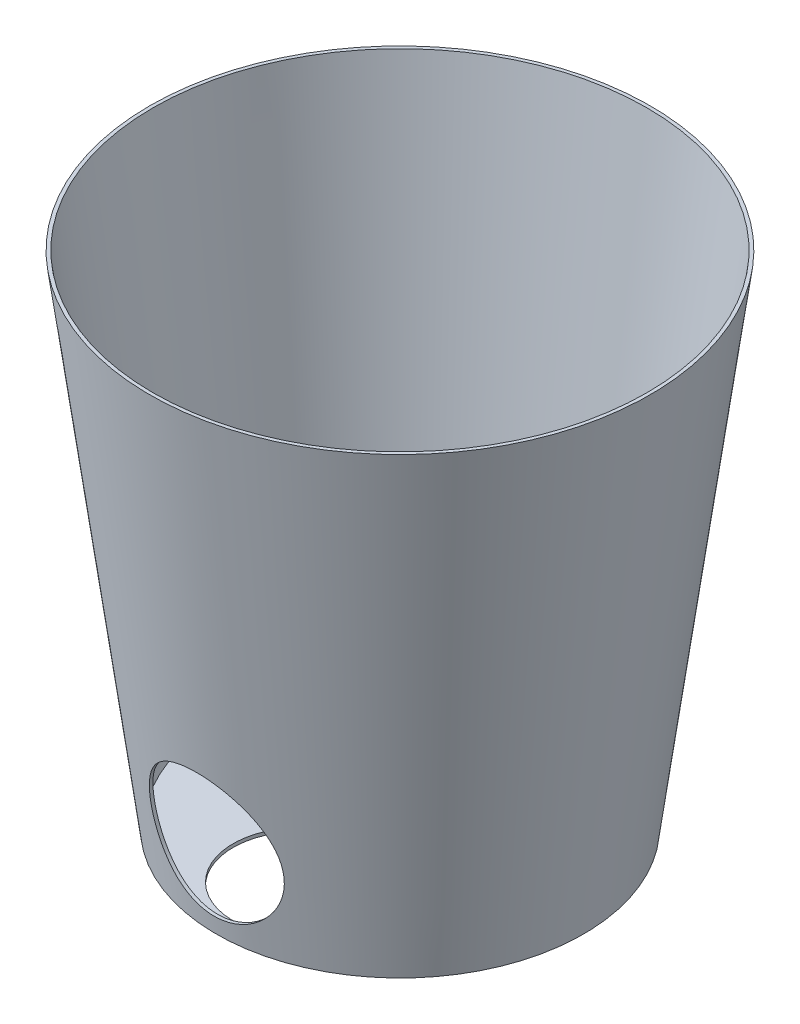
ISO-10303-21;
HEADER;
FILE_DESCRIPTION(('STEP AP214'),'2;1');
FILE_NAME('part.step','',(''),(''),'','','');
FILE_SCHEMA(('AUTOMOTIVE_DESIGN { 1 0 10303 214 1 1 1 1 }'));
ENDSEC;
DATA;
#1=APPLICATION_CONTEXT('core data for automotive mechanical design processes');
#2=APPLICATION_PROTOCOL_DEFINITION('international standard','automotive_design',2000,#1);
#3=PRODUCT_CONTEXT('',#1,'mechanical');
#4=PRODUCT('Part','Part','',(#3));
#5=PRODUCT_RELATED_PRODUCT_CATEGORY('part','',(#4));
#6=PRODUCT_DEFINITION_FORMATION('','',#4);
#7=PRODUCT_DEFINITION_CONTEXT('part definition',#1,'design');
#8=PRODUCT_DEFINITION('design','',#6,#7);
#9=PRODUCT_DEFINITION_SHAPE('','',#8);
#10=(LENGTH_UNIT() NAMED_UNIT(*) SI_UNIT(.MILLI.,.METRE.));
#11=(NAMED_UNIT(*) PLANE_ANGLE_UNIT() SI_UNIT($,.RADIAN.));
#12=(NAMED_UNIT(*) SI_UNIT($,.STERADIAN.) SOLID_ANGLE_UNIT());
#13=UNCERTAINTY_MEASURE_WITH_UNIT(LENGTH_MEASURE(1.E-05),#10,'distance_accuracy_value','');
#14=(GEOMETRIC_REPRESENTATION_CONTEXT(3) GLOBAL_UNCERTAINTY_ASSIGNED_CONTEXT((#13)) GLOBAL_UNIT_ASSIGNED_CONTEXT((#10,
#11,#12)) REPRESENTATION_CONTEXT('',''));
#15=CARTESIAN_POINT('',(0.,0.,0.));
#16=DIRECTION('',(0.,0.,1.));
#17=DIRECTION('',(1.,0.,0.));
#18=AXIS2_PLACEMENT_3D('',#15,#16,#17);
#19=CARTESIAN_POINT('',(0.,300.,0.));
#20=DIRECTION('',(0.,1.,0.));
#21=DIRECTION('',(-1.,0.,0.));
#22=AXIS2_PLACEMENT_3D('',#19,#20,#21);
#23=CONICAL_SURFACE('',#22,150.,0.132551532296674);
#24=CARTESIAN_POINT('',(0.,300.,0.));
#25=DIRECTION('',(0.,1.,0.));
#26=DIRECTION('',(-1.,0.,0.));
#27=AXIS2_PLACEMENT_3D('',#24,#25,#26);
#28=CIRCLE('',#27,150.);
#29=CARTESIAN_POINT('',(-150.,300.,0.));
#30=VERTEX_POINT('',#29);
#31=EDGE_CURVE('E39',#30,#30,#28,.T.);
#32=ORIENTED_EDGE('',*,*,#31,.F.);
#33=EDGE_LOOP('',(#32));
#34=FACE_BOUND('',#33,.T.);
#35=CARTESIAN_POINT('',(0.,0.,0.));
#36=DIRECTION('',(0.,1.,0.));
#37=DIRECTION('',(-1.,0.,0.));
#38=AXIS2_PLACEMENT_3D('',#35,#36,#37);
#39=CIRCLE('',#38,110.);
#40=CARTESIAN_POINT('',(-110.,0.,0.));
#41=VERTEX_POINT('',#40);
#42=EDGE_CURVE('E10',#41,#41,#39,.T.);
#43=ORIENTED_EDGE('',*,*,#42,.T.);
#44=EDGE_LOOP('',(#43));
#45=FACE_BOUND('',#44,.T.);
#46=CARTESIAN_POINT('',(-28.8552117618387,22.2984340843437,109.225929263817));
#47=CARTESIAN_POINT('',(-29.6078526772952,23.0824165417895,109.135215601533));
#48=CARTESIAN_POINT('',(-30.3287880892968,23.8973596000106,109.049399933345));
#49=CARTESIAN_POINT('',(-31.7024768841229,25.5841075054749,108.892248887753));
#50=CARTESIAN_POINT('',(-32.355233917478,26.4559093042196,108.820912734867));
#51=CARTESIAN_POINT('',(-33.587824200434,28.2504588450548,108.69726684741));
#52=CARTESIAN_POINT('',(-34.1676839250266,29.1731879150501,108.644950192165));
#53=CARTESIAN_POINT('',(-35.2505760178368,31.0636986944687,108.563495523031));
#54=CARTESIAN_POINT('',(-35.7536078515846,32.0314807172515,108.534357670384));
#55=CARTESIAN_POINT('',(-36.6799680149464,34.0071133769449,108.502901502679));
#56=CARTESIAN_POINT('',(-37.1031466734675,35.0150350512853,108.500633067886));
#57=CARTESIAN_POINT('',(-37.8654986399689,37.0618164896239,108.526018955818));
#58=CARTESIAN_POINT('',(-38.2046721933386,38.1006761632385,108.553673191133));
#59=CARTESIAN_POINT('',(-38.7965979501725,40.2012963618402,108.640984223162));
#60=CARTESIAN_POINT('',(-39.0493600382957,41.2630542527053,108.700637357497));
#61=CARTESIAN_POINT('',(-39.4670066559061,43.401360947773,108.853014464421));
#62=CARTESIAN_POINT('',(-39.6318927753045,44.4779094840119,108.945737838631));
#63=CARTESIAN_POINT('',(-39.8700684361833,46.6092365070189,109.161385572907));
#64=CARTESIAN_POINT('',(-39.9456421726306,47.6638474055755,109.283456053807));
#65=CARTESIAN_POINT('',(-40.0132461544071,49.7717467169899,109.557980834782));
#66=CARTESIAN_POINT('',(-40.0052780097165,50.8250351549423,109.710434549271));
#67=CARTESIAN_POINT('',(-39.9068616452054,52.9232892425858,110.043912917298));
#68=CARTESIAN_POINT('',(-39.8164044570128,53.9682539748456,110.224940675694));
#69=CARTESIAN_POINT('',(-39.5547054778474,56.0430849826622,110.612965765263));
#70=CARTESIAN_POINT('',(-39.3834614778704,57.0729508445671,110.819963806444));
#71=CARTESIAN_POINT('',(-38.9574710469534,59.1350363756711,111.261800321853));
#72=CARTESIAN_POINT('',(-38.7008983475668,60.1667675829523,111.497168727587));
#73=CARTESIAN_POINT('',(-38.25641737981,61.6930558162193,111.86511727582));
#74=CARTESIAN_POINT('',(-38.0983101992325,62.1982931110359,111.990256413299));
#75=CARTESIAN_POINT('',(-37.7625237917422,63.2011924388857,112.245021345092));
#76=CARTESIAN_POINT('',(-37.5848406963009,63.6988529524244,112.374648022736));
#77=CARTESIAN_POINT('',(-37.022945748875,65.1794524693632,112.769459496632));
#78=CARTESIAN_POINT('',(-36.6098789009291,66.1500414386228,113.040583491896));
#79=CARTESIAN_POINT('',(-35.7099524243151,68.0529116090237,113.594072679293));
#80=CARTESIAN_POINT('',(-35.2230870586121,68.9851898247507,113.876438744116));
#81=CARTESIAN_POINT('',(-34.1398631194353,70.8744020805869,114.46896825068));
#82=CARTESIAN_POINT('',(-33.5380770008128,71.8280822336684,114.779645753911));
#83=CARTESIAN_POINT('',(-32.5771434030956,73.2173862130763,115.24697671351));
#84=CARTESIAN_POINT('',(-32.2471059842941,73.673638965409,115.402980297728));
#85=CARTESIAN_POINT('',(-31.5679158904362,74.57201351374,115.714780718406));
#86=CARTESIAN_POINT('',(-31.2187571851858,75.0141307814609,115.870577473589));
#87=CARTESIAN_POINT('',(-30.1433540708662,76.3182039654291,116.336531383407));
#88=CARTESIAN_POINT('',(-29.3891785055201,77.1578872731768,116.645254217388));
#89=CARTESIAN_POINT('',(-27.810615774689,78.772279312574,117.252884690914));
#90=CARTESIAN_POINT('',(-26.9862313167518,79.546990547533,117.551792708343));
#91=CARTESIAN_POINT('',(-25.6863750890817,80.6684221448194,117.993165092794));
#92=CARTESIAN_POINT('',(-25.2349188019589,81.0409725717029,118.141394583244));
#93=CARTESIAN_POINT('',(-24.3152154931545,81.7665444253133,118.432867356452));
#94=CARTESIAN_POINT('',(-23.8469724356255,82.1195704132665,118.576111800873));
#95=CARTESIAN_POINT('',(-22.4177825290221,83.1484645506448,118.997276055708));
#96=CARTESIAN_POINT('',(-21.4323007943207,83.7942129055679,119.266652154694));
#97=CARTESIAN_POINT('',(-19.4030256057108,84.9987817792813,119.776244568045));
#98=CARTESIAN_POINT('',(-18.3592525027189,85.5576323814759,120.016470967481));
#99=CARTESIAN_POINT('',(-16.2201260924834,86.5829704442204,120.462176599163));
#100=CARTESIAN_POINT('',(-15.1247769302509,87.0494653114906,120.667658617637));
#101=CARTESIAN_POINT('',(-12.9566764034448,87.860059376338,121.027762947024));
#102=CARTESIAN_POINT('',(-11.8863925593456,88.2097483813546,121.184667667346));
#103=CARTESIAN_POINT('',(-9.71543836076685,88.8185639519475,121.459434021423));
#104=CARTESIAN_POINT('',(-8.61476905085876,89.0776936265397,121.577296995523));
#105=CARTESIAN_POINT('',(-6.39241646820968,89.5021026516217,121.771038356065));
#106=CARTESIAN_POINT('',(-5.27074437141425,89.6674305275196,121.846938450161));
#107=CARTESIAN_POINT('',(-3.01534234143438,89.9022921502697,121.954922386239));
#108=CARTESIAN_POINT('',(-1.88161320886809,89.9718322181468,121.987009119458));
#109=CARTESIAN_POINT('',(0.295407459960031,90.012494140787,122.005762484004));
#110=CARTESIAN_POINT('',(1.33853651501947,89.9911776064504,121.995918846567));
#111=CARTESIAN_POINT('',(3.41887227487275,89.8672412460667,121.938816696897));
#112=CARTESIAN_POINT('',(4.45607935320611,89.7646266064076,121.891560571382));
#113=CARTESIAN_POINT('',(6.51698310351077,89.4792494999368,121.760657976467));
#114=CARTESIAN_POINT('',(7.54068064179793,89.2964921983509,121.677013852291));
#115=CARTESIAN_POINT('',(9.56749553949532,88.8527899976588,121.475101419155));
#116=CARTESIAN_POINT('',(10.5706125495393,88.5918437724224,121.356832522938));
#117=CARTESIAN_POINT('',(12.5390468470389,87.9976056483088,121.089527283522));
#118=CARTESIAN_POINT('',(13.5046534011471,87.6651160870942,120.94083299324));
#119=CARTESIAN_POINT('',(15.4034167132039,86.9292770149475,120.614788214765));
#120=CARTESIAN_POINT('',(16.3365740064413,86.5259286735796,120.437438199553));
#121=CARTESIAN_POINT('',(18.1654731940975,85.6516907043168,120.057302538831));
#122=CARTESIAN_POINT('',(19.061208734602,85.1807896662115,119.854512597034));
#123=CARTESIAN_POINT('',(20.8105709254929,84.1751126547883,119.427077578062));
#124=CARTESIAN_POINT('',(21.66419563411,83.6403337398856,119.202431494498));
#125=CARTESIAN_POINT('',(23.3812309060486,82.4725549553692,118.719306224354));
#126=CARTESIAN_POINT('',(24.2414534550967,81.835371931385,118.459568240461));
#127=CARTESIAN_POINT('',(25.4890215228946,80.8317186998092,118.058115003916));
#128=CARTESIAN_POINT('',(25.897774613224,80.4891644764301,117.922313846893));
#129=CARTESIAN_POINT('',(26.7007161508975,79.7885160474194,117.647311109864));
#130=CARTESIAN_POINT('',(27.0949016238796,79.4304187003518,117.508108844965));
#131=CARTESIAN_POINT('',(28.2549478873026,78.3335604139713,117.086279908928));
#132=CARTESIAN_POINT('',(28.9982187412577,77.572297472093,116.7994569403));
#133=CARTESIAN_POINT('',(30.4207631996352,75.9943393937437,116.21958840554));
#134=CARTESIAN_POINT('',(31.100033868939,75.1776417179271,115.926542554774));
#135=CARTESIAN_POINT('',(32.0939191172065,73.8811274686743,115.474419301902));
#136=CARTESIAN_POINT('',(32.432442316121,73.419317242662,115.315776762261));
#137=CARTESIAN_POINT('',(33.0893400648887,72.4816199331279,114.998909527437));
#138=CARTESIAN_POINT('',(33.4077190913034,72.0057360118872,114.84068474696));
#139=CARTESIAN_POINT('',(34.3320887534934,70.5576985978421,114.367685781259));
#140=CARTESIAN_POINT('',(34.907345367177,69.5651158880266,114.054571677842));
#141=CARTESIAN_POINT('',(35.9716936066694,67.5315394099065,113.43896165563));
#142=CARTESIAN_POINT('',(36.4607705714161,66.4905374424175,113.136467550528));
#143=CARTESIAN_POINT('',(37.3488522072756,64.366221708145,112.548018138222));
#144=CARTESIAN_POINT('',(37.747858322115,63.2829086198842,112.262062565981));
#145=CARTESIAN_POINT('',(38.4548108973039,61.0718299140181,111.710142325698));
#146=CARTESIAN_POINT('',(38.7620015709496,59.9437775151473,111.444356333113));
#147=CARTESIAN_POINT('',(39.2773418697686,57.6590880282483,110.940677716384));
#148=CARTESIAN_POINT('',(39.4854899907914,56.502450506381,110.702785515901));
#149=CARTESIAN_POINT('',(39.7994616930055,54.169776859653,110.259689599422));
#150=CARTESIAN_POINT('',(39.9053390148729,52.9937512535365,110.054468762866));
#151=CARTESIAN_POINT('',(40.0124913784919,50.6312156801906,109.680307580765));
#152=CARTESIAN_POINT('',(40.0137747803354,49.4447065584803,109.511364336664));
#153=CARTESIAN_POINT('',(39.9139318795605,47.1540423028701,109.22267153932));
#154=CARTESIAN_POINT('',(39.8199243383446,46.0499007552825,109.100317180862));
#155=CARTESIAN_POINT('',(39.5399441693187,43.8500363506544,108.890097495578));
#156=CARTESIAN_POINT('',(39.3539758513535,42.7543131015248,108.802230552806));
#157=CARTESIAN_POINT('',(38.8909185789472,40.5802587428938,108.66077435527));
#158=CARTESIAN_POINT('',(38.6138459993106,39.5019245444483,108.607178945739));
#159=CARTESIAN_POINT('',(37.9703758111505,37.3711005195967,108.532863904152));
#160=CARTESIAN_POINT('',(37.6039796222472,36.3186102827452,108.512143749649));
#161=CARTESIAN_POINT('',(36.8035168375034,34.2955582554485,108.501379136695));
#162=CARTESIAN_POINT('',(36.3733503511922,33.3234566000361,108.50996404311));
#163=CARTESIAN_POINT('',(35.4372868324046,31.4170427329288,108.551903301028));
#164=CARTESIAN_POINT('',(34.9313926782548,30.4827290866662,108.585256711298));
#165=CARTESIAN_POINT('',(33.8473501773911,28.6579447903386,108.673231340907));
#166=CARTESIAN_POINT('',(33.2691935543624,27.7674791785565,108.727854997874));
#167=CARTESIAN_POINT('',(32.0445984900031,26.036107878547,108.854426562741));
#168=CARTESIAN_POINT('',(31.3981578172239,25.195203811337,108.926375036895));
#169=CARTESIAN_POINT('',(30.0225531844204,23.5456788638021,109.085541863028));
#170=CARTESIAN_POINT('',(29.291602198334,22.7385833813068,109.173125967023));
#171=CARTESIAN_POINT('',(27.7669473075926,21.1871629162904,109.357422822878));
#172=CARTESIAN_POINT('',(26.9732425977449,20.442838739441,109.45413569187));
#173=CARTESIAN_POINT('',(25.3280397837268,19.021420897667,109.652003044742));
#174=CARTESIAN_POINT('',(24.4765318747376,18.344338686819,109.753158281121));
#175=CARTESIAN_POINT('',(22.7211940484768,17.0617400227135,109.955324343077));
#176=CARTESIAN_POINT('',(21.8173631213303,16.4562249514441,110.056335165828));
#177=CARTESIAN_POINT('',(19.9295881692783,15.300141019061,110.257444692353));
#178=CARTESIAN_POINT('',(18.9439310057999,14.7523378050387,110.357379414221));
#179=CARTESIAN_POINT('',(16.9291485923052,13.7415634330416,110.548026102929));
#180=CARTESIAN_POINT('',(15.900022264834,13.2785943793412,110.638737840972));
#181=CARTESIAN_POINT('',(13.8054571771144,12.4409607433088,110.807022965615));
#182=CARTESIAN_POINT('',(12.7400207800404,12.0662904267297,110.884597205291));
#183=CARTESIAN_POINT('',(10.5803023872871,11.4081417715643,111.023324335212));
#184=CARTESIAN_POINT('',(9.48602090786919,11.1246618020754,111.084477519137));
#185=CARTESIAN_POINT('',(7.28598360425345,10.65321883109,111.187354240064));
#186=CARTESIAN_POINT('',(6.1804061030336,10.4644592141412,111.229239565635));
#187=CARTESIAN_POINT('',(3.95672178685722,10.1803983050825,111.292626060639));
#188=CARTESIAN_POINT('',(2.83861501963297,10.0850966570516,111.314127307703));
#189=CARTESIAN_POINT('',(0.598307450401227,9.98876516548923,111.335862264069));
#190=CARTESIAN_POINT('',(-0.523892716793565,9.98772127803404,111.336099141654));
#191=CARTESIAN_POINT('',(-2.76420993317416,10.0798799029399,111.315303087375));
#192=CARTESIAN_POINT('',(-3.8823270239991,10.1730814514789,111.29427037303));
#193=CARTESIAN_POINT('',(-6.08390643941918,10.4501291683835,111.232426657031));
#194=CARTESIAN_POINT('',(-7.16761416652781,10.6321210043444,111.192020543001));
#195=CARTESIAN_POINT('',(-9.31557579000141,11.0843912804471,111.093210543099));
#196=CARTESIAN_POINT('',(-10.3798301442073,11.354667639954,111.03480708138));
#197=CARTESIAN_POINT('',(-12.481918017411,11.9815177464012,110.902296754866));
#198=CARTESIAN_POINT('',(-13.5197441637063,12.3381152891775,110.828185560682));
#199=CARTESIAN_POINT('',(-15.5617803270495,13.1349437209495,110.667231957727));
#200=CARTESIAN_POINT('',(-16.5659886009694,13.5751789387854,110.580388890045));
#201=CARTESIAN_POINT('',(-18.6037407917495,14.5701337280301,110.391033370541));
#202=CARTESIAN_POINT('',(-19.6343524789536,15.1307406687468,110.28784757823));
#203=CARTESIAN_POINT('',(-21.6420179621492,16.3399864383391,110.075831665441));
#204=CARTESIAN_POINT('',(-22.619067898302,16.9886315998661,109.967001139281));
#205=CARTESIAN_POINT('',(-24.5125134738039,18.3691682722845,109.749096614877));
#206=CARTESIAN_POINT('',(-25.4289061548875,19.1010638385884,109.640022605027));
#207=CARTESIAN_POINT('',(-27.1942354343697,20.642774905482,109.42737524706));
#208=CARTESIAN_POINT('',(-28.0431770736444,21.4525845732318,109.323801488082));
#209=CARTESIAN_POINT('',(-28.8552117618387,22.2984340843437,109.225929263817));
#210=B_SPLINE_CURVE_WITH_KNOTS('',3,(#46,#47,#48,#49,#50,#51,#52,#53,#54,#55,#56,#57,#58,#59,
#60,#61,#62,#63,#64,#65,#66,#67,#68,#69,#70,#71,#72,#73,#74,#75,#76,#77,#78,#79,#80,#81,#82,#83,
#84,#85,#86,#87,#88,#89,#90,#91,#92,#93,#94,#95,#96,#97,#98,#99,#100,#101,#102,#103,#104,#105,
#106,#107,#108,#109,#110,#111,#112,#113,#114,#115,#116,#117,#118,#119,#120,#121,#122,#123,#124,
#125,#126,#127,#128,#129,#130,#131,#132,#133,#134,#135,#136,#137,#138,#139,#140,#141,#142,#143,
#144,#145,#146,#147,#148,#149,#150,#151,#152,#153,#154,#155,#156,#157,#158,#159,#160,#161,#162,
#163,#164,#165,#166,#167,#168,#169,#170,#171,#172,#173,#174,#175,#176,#177,#178,#179,#180,#181,
#182,#183,#184,#185,#186,#187,#188,#189,#190,#191,#192,#193,#194,#195,#196,#197,#198,#199,#200,
#201,#202,#203,#204,#205,#206,#207,#208,#209),.UNSPECIFIED.,.T.,.F.,(4,2,2,2,2,2,2,2,2,2,2,2,2,
2,2,2,2,2,2,2,2,2,2,2,2,2,2,2,2,2,2,2,2,2,2,2,2,2,2,2,2,2,2,2,2,2,2,2,2,2,2,2,2,2,2,2,2,2,2,2,2,
2,2,2,2,2,2,2,2,2,2,2,2,2,2,2,2,2,2,2,2,4),(0.,3.27070539874568,6.54123558157395,
9.81057451396892,13.0799361891942,16.3553661434682,19.6307865296932,22.9058321131624,
26.180818440292,29.3700968792672,32.5593138560687,35.7488776121959,38.9385285876065,
42.2013855232529,43.8329854138278,45.464908316172,48.7286517614522,51.9926490576694,
55.4974105329869,57.2499586393887,59.003062657911,62.5092480041785,66.0152981984819,
67.8262000471569,69.6366770370025,73.2573284506525,76.8767236155266,80.4958283954318,
83.9018177428675,87.3076901469043,90.711799019786,94.1156832452047,97.242055958182,
100.368229241221,103.494201070783,106.620225921668,109.712867967827,112.805458972982,
115.898572958793,118.991829437875,122.29268111636,123.94331741824,125.594288899605,
128.89654790176,132.198958275501,133.980998551549,135.762641410588,139.32575670423,
142.889477578502,146.453141326591,150.045379223894,153.637671674452,157.228075439112,
160.818192225954,164.158533002322,167.498717244716,170.838301460371,174.17783260347,
177.363350964034,180.548748277231,183.734510753016,186.920377368288,190.193923310555,
193.467511262493,196.741655888275,200.015863728682,203.408037263646,206.800294928614,
210.19233223475,213.584308872298,216.947259101302,220.310196522952,223.67263288332,
227.035034857329,230.330040603545,233.624968700709,236.920806134759,240.216814198166,
243.745461525591,247.27436280576,250.803436064484,254.332245333423),.UNSPECIFIED.);
#211=CARTESIAN_POINT('',(-28.8552117618387,22.2984340843437,109.225929263817));
#212=VERTEX_POINT('',#211);
#213=EDGE_CURVE('E54',#212,#212,#210,.T.);
#214=ORIENTED_EDGE('',*,*,#213,.T.);
#215=EDGE_LOOP('',(#214));
#216=FACE_BOUND('',#215,.T.);
#217=ADVANCED_FACE('F31',(#34,#45,#216),#23,.T.);
#218=CARTESIAN_POINT('',(0.,300.264327440182,0.));
#219=DIRECTION('',(0.,1.,0.));
#220=DIRECTION('',(-1.,0.,0.));
#221=AXIS2_PLACEMENT_3D('',#218,#219,#220);
#222=CONICAL_SURFACE('',#221,148.017544198635,0.132551532296674);
#223=CARTESIAN_POINT('',(0.,2.,0.));
#224=DIRECTION('',(0.,-1.,0.));
#225=DIRECTION('',(1.,0.,0.));
#226=AXIS2_PLACEMENT_3D('',#223,#224,#225);
#227=CIRCLE('',#226,108.24896720661);
#228=CARTESIAN_POINT('',(108.24896720661,2.00000000000001,0.));
#229=VERTEX_POINT('',#228);
#230=EDGE_CURVE('E44',#229,#229,#227,.F.);
#231=ORIENTED_EDGE('',*,*,#230,.F.);
#232=EDGE_LOOP('',(#231));
#233=FACE_BOUND('',#232,.T.);
#234=CARTESIAN_POINT('',(0.,300.,0.));
#235=DIRECTION('',(0.,1.,0.));
#236=DIRECTION('',(-1.,0.,0.));
#237=AXIS2_PLACEMENT_3D('',#234,#235,#236);
#238=CIRCLE('',#237,147.982300539944);
#239=CARTESIAN_POINT('',(-147.982300539944,300.,0.));
#240=VERTEX_POINT('',#239);
#241=EDGE_CURVE('E74',#240,#240,#238,.T.);
#242=ORIENTED_EDGE('',*,*,#241,.T.);
#243=EDGE_LOOP('',(#242));
#244=FACE_BOUND('',#243,.T.);
#245=CARTESIAN_POINT('',(-28.8451658906826,22.2879736443002,107.138943702492));
#246=CARTESIAN_POINT('',(-29.5973320040206,23.0708925188874,107.044544717457));
#247=CARTESIAN_POINT('',(-30.3178739265394,23.8847274452073,106.955030115827));
#248=CARTESIAN_POINT('',(-31.6909668844713,25.5692177008528,106.790547549397));
#249=CARTESIAN_POINT('',(-32.3435222190086,26.4398694317049,106.715578664541));
#250=CARTESIAN_POINT('',(-33.575880919214,28.232078656523,106.584837414705));
#251=CARTESIAN_POINT('',(-34.1557143823604,29.1536148619243,106.529057091364));
#252=CARTESIAN_POINT('',(-35.2387630533953,31.0417811152081,106.440939681975));
#253=CARTESIAN_POINT('',(-35.7419775592124,32.0084115761902,106.408602810733));
#254=CARTESIAN_POINT('',(-36.668946047858,33.981911172431,106.371104907151));
#255=CARTESIAN_POINT('',(-37.0925420834057,34.988855583597,106.365997354708));
#256=CARTESIAN_POINT('',(-37.8558824117355,37.0337666676496,106.386167560915));
#257=CARTESIAN_POINT('',(-38.195627000179,38.0717332311371,106.411445212424));
#258=CARTESIAN_POINT('',(-38.788825538761,40.1706458672972,106.494540330089));
#259=CARTESIAN_POINT('',(-39.0422893315713,41.2315893041358,106.55235408262));
#260=CARTESIAN_POINT('',(-39.4614517104428,43.3683249035618,106.701640401913));
#261=CARTESIAN_POINT('',(-39.6271519752752,44.4441167817191,106.793112324793));
#262=CARTESIAN_POINT('',(-39.8668726297207,46.5725130431574,107.006745670094));
#263=CARTESIAN_POINT('',(-39.9432913398942,47.6249404528881,107.127992902125));
#264=CARTESIAN_POINT('',(-40.0129196574536,49.728491401844,107.401362217593));
#265=CARTESIAN_POINT('',(-40.0061309443028,50.779614966958,107.553483677802));
#266=CARTESIAN_POINT('',(-39.9104144654787,52.8735712839856,107.88677231848));
#267=CARTESIAN_POINT('',(-39.8214776530215,53.9164031099908,108.067942696223));
#268=CARTESIAN_POINT('',(-39.5631694786654,55.9870205299211,108.456697981078));
#269=CARTESIAN_POINT('',(-39.3937958853992,57.0148057056273,108.664283620848));
#270=CARTESIAN_POINT('',(-38.9719791832517,59.0726380927379,109.107692897354));
#271=CARTESIAN_POINT('',(-38.7177281803883,60.1022014358805,109.344052936365));
#272=CARTESIAN_POINT('',(-38.2770290443363,61.6253444253991,109.713771455265));
#273=CARTESIAN_POINT('',(-38.1202324543065,62.1295509544782,109.839547694827));
#274=CARTESIAN_POINT('',(-37.7871675243194,63.1304298153374,110.095675659133));
#275=CARTESIAN_POINT('',(-37.6108953657051,63.6271006477719,110.226028277758));
#276=CARTESIAN_POINT('',(-37.053381551838,65.1048082406514,110.623144255174));
#277=CARTESIAN_POINT('',(-36.6434345322468,66.0735677792258,110.895972495703));
#278=CARTESIAN_POINT('',(-35.7501315732959,67.973041253323,111.453166714681));
#279=CARTESIAN_POINT('',(-35.2667698032567,68.9037521595238,111.737533608225));
#280=CARTESIAN_POINT('',(-34.1900237036145,70.7920926087389,112.335130311253));
#281=CARTESIAN_POINT('',(-33.5910693779472,71.7463916205477,112.648911128783));
#282=CARTESIAN_POINT('',(-32.6344227084995,73.1367926006964,113.121094100775));
#283=CARTESIAN_POINT('',(-32.3058206937581,73.5934393826045,113.27874802641));
#284=CARTESIAN_POINT('',(-31.6295114083289,74.4926636930935,113.593906882394));
#285=CARTESIAN_POINT('',(-31.2817981344026,74.9352367311105,113.751411749935));
#286=CARTESIAN_POINT('',(-30.2107274674691,76.2407928212585,114.222568853718));
#287=CARTESIAN_POINT('',(-29.4594451224645,77.0816042850516,114.534860663511));
#288=CARTESIAN_POINT('',(-27.8866327807691,78.6985655705888,115.149760212827));
#289=CARTESIAN_POINT('',(-27.0651054381712,79.4747178331896,115.45236831764));
#290=CARTESIAN_POINT('',(-25.7687038000266,80.5992888424347,115.899677567692));
#291=CARTESIAN_POINT('',(-25.3178506388342,80.9733782483823,116.050112388715));
#292=CARTESIAN_POINT('',(-24.3992568962381,81.7020492997403,116.345984240394));
#293=CARTESIAN_POINT('',(-23.9315202875062,82.056635485332,116.491422431238));
#294=CARTESIAN_POINT('',(-22.5036949254396,83.0902399492486,116.919131570525));
#295=CARTESIAN_POINT('',(-21.518917581223,83.7391675661964,117.19282248254));
#296=CARTESIAN_POINT('',(-19.4906001377632,84.9501289534674,117.710828663648));
#297=CARTESIAN_POINT('',(-18.4470808013597,85.5121931665346,117.955154217623));
#298=CARTESIAN_POINT('',(-16.3079761404755,86.5439378499046,118.408728448579));
#299=CARTESIAN_POINT('',(-15.2123950957713,87.0136258978118,118.617980002469));
#300=CARTESIAN_POINT('',(-13.0441433583815,87.8300316524527,118.98483513897));
#301=CARTESIAN_POINT('',(-11.9739972368069,88.1824089571135,119.144773236094));
#302=CARTESIAN_POINT('',(-9.80293256456223,88.7965838165298,119.425177519346));
#303=CARTESIAN_POINT('',(-8.70201507886561,89.0583845018884,119.545645069688));
#304=CARTESIAN_POINT('',(-6.47881961730849,89.4880492699313,119.744085328943));
#305=CARTESIAN_POINT('',(-5.3565533584046,89.6559634256518,119.82208068921));
#306=CARTESIAN_POINT('',(-3.09964473140608,89.8958606508679,119.933684679993));
#307=CARTESIAN_POINT('',(-1.96500321535364,89.9678502832983,119.967296347138));
#308=CARTESIAN_POINT('',(0.211692448025311,90.012990306779,119.988363253938));
#309=CARTESIAN_POINT('',(1.25355994356343,89.9938978360675,119.979441004262));
#310=CARTESIAN_POINT('',(3.33157417556059,89.8745974867377,119.923813592315));
#311=CARTESIAN_POINT('',(4.3677212818065,89.7743949146808,119.877110901799));
#312=CARTESIAN_POINT('',(6.42669672600629,89.4940132938214,119.746938096083));
#313=CARTESIAN_POINT('',(7.44952594762448,89.3138395793627,119.663470433233));
#314=CARTESIAN_POINT('',(9.47479103242209,88.8754659218414,119.461534945099));
#315=CARTESIAN_POINT('',(10.4772265497404,88.6172646566684,119.343066526758));
#316=CARTESIAN_POINT('',(12.4436241792481,88.0289012093846,119.075118066582));
#317=CARTESIAN_POINT('',(13.4078969494143,87.699604709859,118.926012051656));
#318=CARTESIAN_POINT('',(15.3042367268574,86.9704252871485,118.598850701279));
#319=CARTESIAN_POINT('',(16.2363042901016,86.5705435832238,118.420795865882));
#320=CARTESIAN_POINT('',(18.0632914250268,85.7035024766818,118.038969308604));
#321=CARTESIAN_POINT('',(18.9582047081784,85.2363317444133,117.835193256681));
#322=CARTESIAN_POINT('',(20.7062201016311,84.2383644012374,117.405518660446));
#323=CARTESIAN_POINT('',(21.5593202579565,83.7075648208669,117.179619083751));
#324=CARTESIAN_POINT('',(23.2764421891484,82.54769173705,116.693406895416));
#325=CARTESIAN_POINT('',(24.1372502824033,81.9143871499922,116.431798352236));
#326=CARTESIAN_POINT('',(25.3859321903887,80.916638518561,116.027318905816));
#327=CARTESIAN_POINT('',(25.795095934376,80.576067034447,115.890472178347));
#328=CARTESIAN_POINT('',(26.598941397378,79.879411229125,115.613308850536));
#329=CARTESIAN_POINT('',(26.9936201791051,79.523323793235,115.472991555977));
#330=CARTESIAN_POINT('',(28.1552845932472,78.4325247609254,115.04771691667));
#331=CARTESIAN_POINT('',(28.89981154888,77.6753458195185,114.758465103394));
#332=CARTESIAN_POINT('',(30.32526003745,76.1056070876516,114.173512307028));
#333=CARTESIAN_POINT('',(31.0061785616089,75.2930446806084,113.877811019683));
#334=CARTESIAN_POINT('',(32.0036023318229,74.0020262192179,113.42114783023));
#335=CARTESIAN_POINT('',(32.3438265267182,73.5415492041307,113.260686467261));
#336=CARTESIAN_POINT('',(33.0041781711496,72.606454891471,112.940136804215));
#337=CARTESIAN_POINT('',(33.3243100703149,72.1318407592735,112.780048429152));
#338=CARTESIAN_POINT('',(34.254020660431,70.6875084584035,112.301407372481));
#339=CARTESIAN_POINT('',(34.8329468748981,69.69725814606,111.984463717978));
#340=CARTESIAN_POINT('',(35.9048639020661,67.667994785571,111.361155440022));
#341=CARTESIAN_POINT('',(36.3978388937061,66.6289728045932,111.054792772518));
#342=CARTESIAN_POINT('',(37.2939233146923,64.5082104756778,110.458684718481));
#343=CARTESIAN_POINT('',(37.6970341497873,63.4264707962868,110.16893907206));
#344=CARTESIAN_POINT('',(38.4127488745822,61.2170077548436,109.609342680974));
#345=CARTESIAN_POINT('',(38.7245066457323,60.0889584579186,109.339694178354));
#346=CARTESIAN_POINT('',(39.2489066772473,57.8036884888215,108.828696985104));
#347=CARTESIAN_POINT('',(39.4615473380831,56.6464673461983,108.587348751225));
#348=CARTESIAN_POINT('',(39.784340098804,54.3120601478002,108.137911343847));
#349=CARTESIAN_POINT('',(39.8945483548538,53.1348853920046,107.929803998698));
#350=CARTESIAN_POINT('',(40.0101189796868,50.7694888490561,107.550578382276));
#351=CARTESIAN_POINT('',(40.0154900735646,49.5812679894522,107.379457034007));
#352=CARTESIAN_POINT('',(39.9233157792873,47.2891115862215,107.08765018536));
#353=CARTESIAN_POINT('',(39.8331016692914,46.1852242990191,106.964233284082));
#354=CARTESIAN_POINT('',(39.5607553997726,43.9854593607737,106.752521507187));
#355=CARTESIAN_POINT('',(39.3786276731579,42.8895813260374,106.664224938116));
#356=CARTESIAN_POINT('',(38.9232579976652,40.7148491378854,106.522573340852));
#357=CARTESIAN_POINT('',(38.6500329737315,39.6359918611531,106.469211827538));
#358=CARTESIAN_POINT('',(38.0142365050552,37.50378536464,106.396025275044));
#359=CARTESIAN_POINT('',(37.6516665511123,36.4504357195638,106.37619967633));
#360=CARTESIAN_POINT('',(36.8593779731699,34.4272863607743,106.367802854256));
#361=CARTESIAN_POINT('',(36.4337104481817,33.4559018980841,106.377779229557));
#362=CARTESIAN_POINT('',(35.5068833919377,31.5505135765483,106.422929664412));
#363=CARTESIAN_POINT('',(35.0057268441264,30.6165082422666,106.45810272836));
#364=CARTESIAN_POINT('',(33.9313670252196,28.7919028644767,106.550098652192));
#365=CARTESIAN_POINT('',(33.3581552401773,27.9013079675715,106.606924072103));
#366=CARTESIAN_POINT('',(32.1436222831213,26.1692119429055,106.738226058462));
#367=CARTESIAN_POINT('',(31.5022988042554,25.3277124794379,106.812703222855));
#368=CARTESIAN_POINT('',(30.1364658631886,23.6755856359851,106.977356303748));
#369=CARTESIAN_POINT('',(29.4101013621305,22.8665303545628,107.0679204074));
#370=CARTESIAN_POINT('',(27.8945689126864,21.3107613208104,107.258406401592));
#371=CARTESIAN_POINT('',(27.1054001291628,20.5640483977459,107.358328416571));
#372=CARTESIAN_POINT('',(25.4691597952179,19.1373973178387,107.562760567589));
#373=CARTESIAN_POINT('',(24.6220779358599,18.4574711022658,107.6672715193));
#374=CARTESIAN_POINT('',(22.8754272750602,17.1687221224565,107.876209844703));
#375=CARTESIAN_POINT('',(21.975857411196,16.5599007982209,107.980637216659));
#376=CARTESIAN_POINT('',(20.0949314703526,15.3956255461549,108.188855053427));
#377=CARTESIAN_POINT('',(19.1117698727762,14.8430540919157,108.292472638364));
#378=CARTESIAN_POINT('',(17.1015223262566,13.8225399870353,108.490327189452));
#379=CARTESIAN_POINT('',(16.0744352380771,13.3545995330022,108.584563912092));
#380=CARTESIAN_POINT('',(13.9834598378074,12.5068616112548,108.75962843834));
#381=CARTESIAN_POINT('',(12.9195739566608,12.1270583338917,108.840457125652));
#382=CARTESIAN_POINT('',(10.7624454820272,11.4585323226612,108.985316554379));
#383=CARTESIAN_POINT('',(9.66920343752679,11.1698078868231,109.049347609685));
#384=CARTESIAN_POINT('',(7.47106254658287,10.6879411692531,109.157466778715));
#385=CARTESIAN_POINT('',(6.3663530455276,10.4939739742997,109.2017267102));
#386=CARTESIAN_POINT('',(4.14390914068261,10.1994412500495,109.269327298772));
#387=CARTESIAN_POINT('',(3.0261747894509,10.0988753439908,109.292668040244));
#388=CARTESIAN_POINT('',(0.786152119094139,9.99201276270099,109.317479197867));
#389=CARTESIAN_POINT('',(-0.336135409331417,9.98570036616435,109.318953261338));
#390=CARTESIAN_POINT('',(-2.57708062867791,10.0673599030584,109.299979956291));
#391=CARTESIAN_POINT('',(-3.69573835818621,10.1553308308742,109.279532821584));
#392=CARTESIAN_POINT('',(-5.89730499512524,10.4219136716559,109.218214437846));
#393=CARTESIAN_POINT('',(-6.98046674028128,10.5985464639324,109.177789429489));
#394=CARTESIAN_POINT('',(-9.12776873839211,11.0399531052827,109.078323835086));
#395=CARTESIAN_POINT('',(-10.1919095043543,11.3047245734114,109.019283751902));
#396=CARTESIAN_POINT('',(-12.2942584221457,11.9204602061487,108.884874246759));
#397=CARTESIAN_POINT('',(-13.3324581139256,12.2714520954562,108.809499573233));
#398=CARTESIAN_POINT('',(-15.3756925473551,13.0569864796631,108.645403678533));
#399=CARTESIAN_POINT('',(-16.3807252243083,13.4915341645838,108.556681628368));
#400=CARTESIAN_POINT('',(-18.4365353438009,14.4823086067747,108.361311179307));
#401=CARTESIAN_POINT('',(-19.4837264806199,15.045817647594,108.253775526245));
#402=CARTESIAN_POINT('',(-21.5233938958492,16.2634546050238,108.032309465294));
#403=CARTESIAN_POINT('',(-22.5158652951844,16.91759058416,107.918378488989));
#404=CARTESIAN_POINT('',(-24.4387130035163,18.3115241602132,107.689842097692));
#405=CARTESIAN_POINT('',(-25.3690856774185,19.0513267649064,107.575236643646));
#406=CARTESIAN_POINT('',(-27.1606532086103,20.6110686041458,107.351451661239));
#407=CARTESIAN_POINT('',(-28.021854361354,21.431000530853,107.242271639443));
#408=CARTESIAN_POINT('',(-28.8451658906826,22.2879736443002,107.138943702492));
#409=B_SPLINE_CURVE_WITH_KNOTS('',3,(#245,#246,#247,#248,#249,#250,#251,#252,#253,#254,#255,
#256,#257,#258,#259,#260,#261,#262,#263,#264,#265,#266,#267,#268,#269,#270,#271,#272,#273,#274,
#275,#276,#277,#278,#279,#280,#281,#282,#283,#284,#285,#286,#287,#288,#289,#290,#291,#292,#293,
#294,#295,#296,#297,#298,#299,#300,#301,#302,#303,#304,#305,#306,#307,#308,#309,#310,#311,#312,
#313,#314,#315,#316,#317,#318,#319,#320,#321,#322,#323,#324,#325,#326,#327,#328,#329,#330,#331,
#332,#333,#334,#335,#336,#337,#338,#339,#340,#341,#342,#343,#344,#345,#346,#347,#348,#349,#350,
#351,#352,#353,#354,#355,#356,#357,#358,#359,#360,#361,#362,#363,#364,#365,#366,#367,#368,#369,
#370,#371,#372,#373,#374,#375,#376,#377,#378,#379,#380,#381,#382,#383,#384,#385,#386,#387,#388,
#389,#390,#391,#392,#393,#394,#395,#396,#397,#398,#399,#400,#401,#402,#403,#404,#405,#406,#407,
#408),.UNSPECIFIED.,.T.,.F.,(4,2,2,2,2,2,2,2,2,2,2,2,2,2,2,2,2,2,2,2,2,2,2,2,2,2,2,2,2,2,2,2,2,
2,2,2,2,2,2,2,2,2,2,2,2,2,2,2,2,2,2,2,2,2,2,2,2,2,2,2,2,2,2,2,2,2,2,2,2,2,2,2,2,2,2,2,2,2,2,2,2,
4),(0.,3.26835729665808,6.53650779350958,9.80330120240419,13.070124543634,16.343361750327,
19.6165874153709,22.8894395547523,26.1622290876217,29.3449203906296,32.5275474541176,
35.7105250549026,38.8935909586597,42.1493134111317,43.7773452989707,45.4056969703005,
48.6623117442506,51.9191852974767,55.4235972021151,57.1759722832004,58.9289010026439,
62.4347907449867,65.9405480814822,67.7545847609267,69.5681973453013,73.1951234613524,
76.8207755632597,80.4461301292551,83.8554691583584,87.2646903385823,90.6720915208966,
94.0792595647031,97.201693932444,100.323924034005,103.445945903622,106.568020676204,
109.654031907364,112.739989837228,115.826467967597,118.913090195403,122.209943589011,
123.858581224152,125.507551346419,128.805834506069,132.104273600755,133.887589445794,
135.670508954884,139.236182122494,142.80251093303,146.368783951419,149.967113446703,
153.565501008991,157.16191467404,160.75802902554,164.097013875894,167.435837705501,
170.774041561198,174.112189719764,177.290349059776,180.468382826888,183.646792459646,
186.825309775242,190.094766640508,193.364266988513,196.634350853672,199.904500932374,
203.298107272952,206.691801682369,210.085272329492,213.4786795598,216.841994190598,
220.205295254411,223.568035319761,226.930739518876,230.221513320378,233.512198233367,
236.803942674342,240.095891646264,243.673192570224,247.250811949424,250.828640569626,
254.40614319383),.UNSPECIFIED.);
#410=CARTESIAN_POINT('',(-28.8451658906826,22.2879736443002,107.138943702492));
#411=VERTEX_POINT('',#410);
#412=EDGE_CURVE('E47',#411,#411,#409,.T.);
#413=ORIENTED_EDGE('',*,*,#412,.F.);
#414=EDGE_LOOP('',(#413));
#415=FACE_BOUND('',#414,.T.);
#416=ADVANCED_FACE('F55',(#233,#244,#415),#222,.F.);
#417=CARTESIAN_POINT('',(-150.,300.,0.));
#418=DIRECTION('',(0.,1.,0.));
#419=DIRECTION('',(-1.,0.,0.));
#420=AXIS2_PLACEMENT_3D('',#417,#418,#419);
#421=PLANE('',#420);
#422=ORIENTED_EDGE('',*,*,#241,.F.);
#423=EDGE_LOOP('',(#422));
#424=FACE_BOUND('',#423,.T.);
#425=ORIENTED_EDGE('',*,*,#31,.T.);
#426=EDGE_LOOP('',(#425));
#427=FACE_BOUND('',#426,.T.);
#428=ADVANCED_FACE('F33',(#424,#427),#421,.T.);
#429=CARTESIAN_POINT('',(-110.,0.,0.));
#430=DIRECTION('',(0.,-1.,0.));
#431=DIRECTION('',(1.,0.,0.));
#432=AXIS2_PLACEMENT_3D('',#429,#430,#431);
#433=PLANE('',#432);
#434=CARTESIAN_POINT('',(0.,0.,60.));
#435=DIRECTION('',(0.,1.,0.));
#436=DIRECTION('',(0.,0.,1.));
#437=AXIS2_PLACEMENT_3D('',#434,#435,#436);
#438=CIRCLE('',#437,40.);
#439=CARTESIAN_POINT('',(0.,0.,100.));
#440=VERTEX_POINT('',#439);
#441=EDGE_CURVE('E75',#440,#440,#438,.T.);
#442=ORIENTED_EDGE('',*,*,#441,.T.);
#443=EDGE_LOOP('',(#442));
#444=FACE_BOUND('',#443,.T.);
#445=ORIENTED_EDGE('',*,*,#42,.F.);
#446=EDGE_LOOP('',(#445));
#447=FACE_BOUND('',#446,.T.);
#448=ADVANCED_FACE('F79',(#444,#447),#433,.T.);
#449=CARTESIAN_POINT('',(-110.,2.,0.));
#450=DIRECTION('',(0.,-1.,0.));
#451=DIRECTION('',(1.,0.,0.));
#452=AXIS2_PLACEMENT_3D('',#449,#450,#451);
#453=PLANE('',#452);
#454=CARTESIAN_POINT('',(0.,2.00000000000001,60.));
#455=DIRECTION('',(0.,-1.,0.));
#456=DIRECTION('',(1.,0.,0.));
#457=AXIS2_PLACEMENT_3D('',#454,#455,#456);
#458=CIRCLE('',#457,40.);
#459=CARTESIAN_POINT('',(40.,2.00000000000001,60.));
#460=VERTEX_POINT('',#459);
#461=EDGE_CURVE('E35',#460,#460,#458,.F.);
#462=ORIENTED_EDGE('',*,*,#461,.F.);
#463=EDGE_LOOP('',(#462));
#464=FACE_BOUND('',#463,.T.);
#465=ORIENTED_EDGE('',*,*,#230,.T.);
#466=EDGE_LOOP('',(#465));
#467=FACE_BOUND('',#466,.T.);
#468=ADVANCED_FACE('F64',(#464,#467),#453,.F.);
#469=CARTESIAN_POINT('',(0.,50.,150.));
#470=DIRECTION('',(0.,0.,-1.));
#471=DIRECTION('',(-1.,0.,0.));
#472=AXIS2_PLACEMENT_3D('',#469,#470,#471);
#473=CYLINDRICAL_SURFACE('',#472,40.);
#474=ORIENTED_EDGE('',*,*,#213,.F.);
#475=EDGE_LOOP('',(#474));
#476=FACE_BOUND('',#475,.T.);
#477=ORIENTED_EDGE('',*,*,#412,.T.);
#478=EDGE_LOOP('',(#477));
#479=FACE_BOUND('',#478,.T.);
#480=ADVANCED_FACE('F59',(#476,#479),#473,.F.);
#481=CARTESIAN_POINT('',(0.,10.,60.));
#482=DIRECTION('',(0.,-1.,0.));
#483=DIRECTION('',(0.,0.,-1.));
#484=AXIS2_PLACEMENT_3D('',#481,#482,#483);
#485=CYLINDRICAL_SURFACE('',#484,40.);
#486=ORIENTED_EDGE('',*,*,#441,.F.);
#487=EDGE_LOOP('',(#486));
#488=FACE_BOUND('',#487,.T.);
#489=ORIENTED_EDGE('',*,*,#461,.T.);
#490=EDGE_LOOP('',(#489));
#491=FACE_BOUND('',#490,.T.);
#492=ADVANCED_FACE('F63',(#488,#491),#485,.F.);
#493=CLOSED_SHELL('',(#217,#416,#428,#448,#468,#480,#492));
#494=MANIFOLD_SOLID_BREP('B2',#493);
#495=ADVANCED_BREP_SHAPE_REPRESENTATION('',(#18,#494),#14);
#496=SHAPE_DEFINITION_REPRESENTATION(#9,#495);
ENDSEC;
END-ISO-10303-21;
